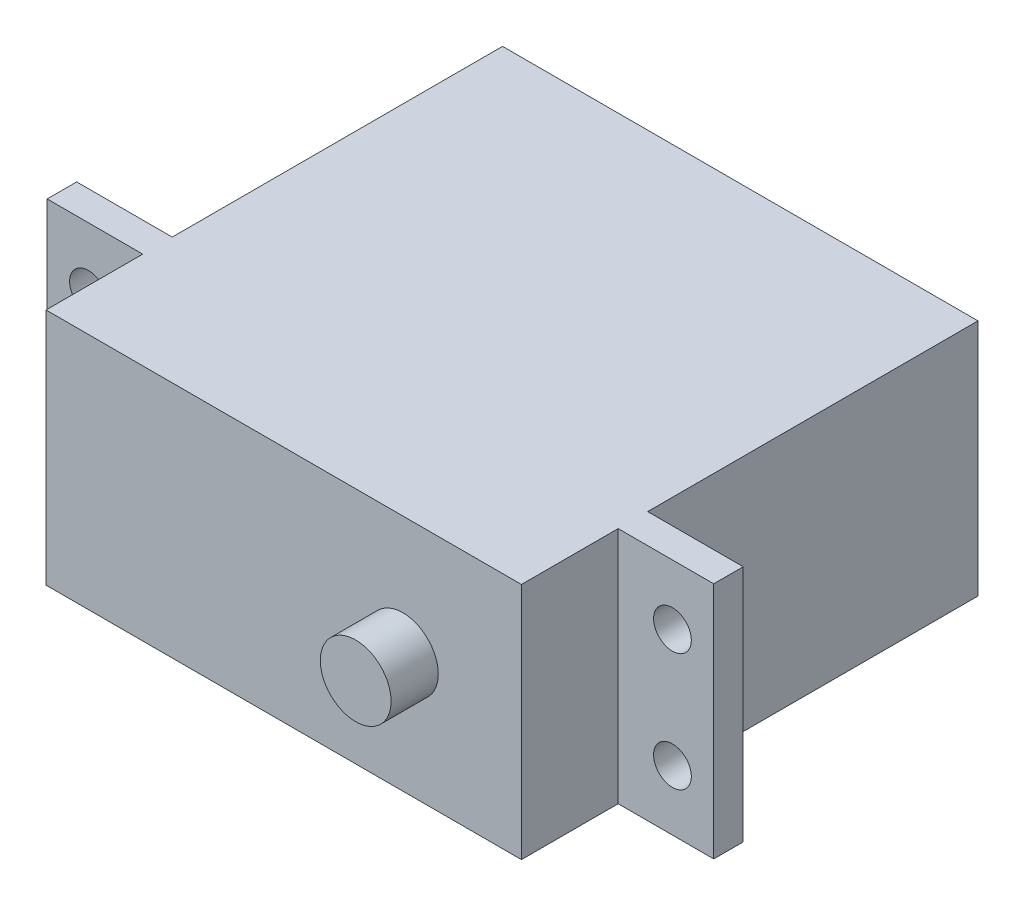
ISO-10303-21;
HEADER;
FILE_DESCRIPTION(('STEP AP214'),'2;1');
FILE_NAME('part.step','',(''),(''),'','','');
FILE_SCHEMA(('AUTOMOTIVE_DESIGN { 1 0 10303 214 1 1 1 1 }'));
ENDSEC;
DATA;
#1=APPLICATION_CONTEXT('core data for automotive mechanical design processes');
#2=APPLICATION_PROTOCOL_DEFINITION('international standard','automotive_design',2000,#1);
#3=PRODUCT_CONTEXT('',#1,'mechanical');
#4=PRODUCT('Part','Part','',(#3));
#5=PRODUCT_RELATED_PRODUCT_CATEGORY('part','',(#4));
#6=PRODUCT_DEFINITION_FORMATION('','',#4);
#7=PRODUCT_DEFINITION_CONTEXT('part definition',#1,'design');
#8=PRODUCT_DEFINITION('design','',#6,#7);
#9=PRODUCT_DEFINITION_SHAPE('','',#8);
#10=(LENGTH_UNIT() NAMED_UNIT(*) SI_UNIT(.MILLI.,.METRE.));
#11=(NAMED_UNIT(*) PLANE_ANGLE_UNIT() SI_UNIT($,.RADIAN.));
#12=(NAMED_UNIT(*) SI_UNIT($,.STERADIAN.) SOLID_ANGLE_UNIT());
#13=UNCERTAINTY_MEASURE_WITH_UNIT(LENGTH_MEASURE(1.E-05),#10,'distance_accuracy_value','');
#14=(GEOMETRIC_REPRESENTATION_CONTEXT(3) GLOBAL_UNCERTAINTY_ASSIGNED_CONTEXT((#13)) GLOBAL_UNIT_ASSIGNED_CONTEXT((#10,
#11,#12)) REPRESENTATION_CONTEXT('',''));
#15=CARTESIAN_POINT('',(0.,0.,0.));
#16=DIRECTION('',(0.,0.,1.));
#17=DIRECTION('',(1.,0.,0.));
#18=AXIS2_PLACEMENT_3D('',#15,#16,#17);
#19=CARTESIAN_POINT('',(-121.25,93.5,12.7));
#20=DIRECTION('',(1.,0.,0.));
#21=DIRECTION('',(0.,0.,-1.));
#22=AXIS2_PLACEMENT_3D('',#19,#20,#21);
#23=PLANE('',#22);
#24=DIRECTION('',(0.,-1.,0.));
#25=VECTOR('',#24,1.);
#26=CARTESIAN_POINT('',(-121.25,93.5,2.));
#27=LINE('',#26,#25);
#28=CARTESIAN_POINT('',(-121.25,93.5,2.));
#29=VERTEX_POINT('',#28);
#30=CARTESIAN_POINT('',(-121.25,73.3,2.));
#31=VERTEX_POINT('',#30);
#32=EDGE_CURVE('E60',#29,#31,#27,.T.);
#33=ORIENTED_EDGE('',*,*,#32,.F.);
#34=DIRECTION('',(0.,0.,-1.));
#35=VECTOR('',#34,1.);
#36=CARTESIAN_POINT('',(-121.25,93.5,12.7));
#37=LINE('',#36,#35);
#38=CARTESIAN_POINT('',(-121.25,93.5,-26.));
#39=VERTEX_POINT('',#38);
#40=EDGE_CURVE('E179',#29,#39,#37,.T.);
#41=ORIENTED_EDGE('',*,*,#40,.T.);
#42=DIRECTION('',(0.,-1.,0.));
#43=VECTOR('',#42,1.);
#44=CARTESIAN_POINT('',(-121.25,93.5,-26.));
#45=LINE('',#44,#43);
#46=CARTESIAN_POINT('',(-121.25,73.3,-26.));
#47=VERTEX_POINT('',#46);
#48=EDGE_CURVE('E169',#39,#47,#45,.T.);
#49=ORIENTED_EDGE('',*,*,#48,.T.);
#50=DIRECTION('',(0.,0.,-1.));
#51=VECTOR('',#50,1.);
#52=CARTESIAN_POINT('',(-121.25,73.3,12.7));
#53=LINE('',#52,#51);
#54=EDGE_CURVE('E198',#31,#47,#53,.T.);
#55=ORIENTED_EDGE('',*,*,#54,.F.);
#56=EDGE_LOOP('',(#33,#41,#49,#55));
#57=FACE_BOUND('',#56,.T.);
#58=ADVANCED_FACE('F41',(#57),#23,.F.);
#59=CARTESIAN_POINT('',(-80.95,73.3,12.7));
#60=DIRECTION('',(-1.,0.,0.));
#61=DIRECTION('',(0.,0.,1.));
#62=AXIS2_PLACEMENT_3D('',#59,#60,#61);
#63=PLANE('',#62);
#64=DIRECTION('',(0.,1.,0.));
#65=VECTOR('',#64,1.);
#66=CARTESIAN_POINT('',(-80.95,73.3,2.));
#67=LINE('',#66,#65);
#68=CARTESIAN_POINT('',(-80.95,73.3,2.));
#69=VERTEX_POINT('',#68);
#70=CARTESIAN_POINT('',(-80.95,93.5,2.));
#71=VERTEX_POINT('',#70);
#72=EDGE_CURVE('E200',#69,#71,#67,.T.);
#73=ORIENTED_EDGE('',*,*,#72,.F.);
#74=DIRECTION('',(0.,0.,-1.));
#75=VECTOR('',#74,1.);
#76=CARTESIAN_POINT('',(-80.95,73.3,12.7));
#77=LINE('',#76,#75);
#78=CARTESIAN_POINT('',(-80.95,73.3,-26.));
#79=VERTEX_POINT('',#78);
#80=EDGE_CURVE('E196',#69,#79,#77,.T.);
#81=ORIENTED_EDGE('',*,*,#80,.T.);
#82=DIRECTION('',(0.,1.,0.));
#83=VECTOR('',#82,1.);
#84=CARTESIAN_POINT('',(-80.95,73.3,-26.));
#85=LINE('',#84,#83);
#86=CARTESIAN_POINT('',(-80.95,93.5,-26.));
#87=VERTEX_POINT('',#86);
#88=EDGE_CURVE('E187',#79,#87,#85,.T.);
#89=ORIENTED_EDGE('',*,*,#88,.T.);
#90=DIRECTION('',(0.,0.,-1.));
#91=VECTOR('',#90,1.);
#92=CARTESIAN_POINT('',(-80.95,93.5,12.7));
#93=LINE('',#92,#91);
#94=EDGE_CURVE('E195',#71,#87,#93,.T.);
#95=ORIENTED_EDGE('',*,*,#94,.F.);
#96=EDGE_LOOP('',(#73,#81,#89,#95));
#97=FACE_BOUND('',#96,.T.);
#98=ADVANCED_FACE('F246',(#97),#63,.F.);
#99=CARTESIAN_POINT('',(-121.25,93.5,12.7));
#100=VERTEX_POINT('',#99);
#101=CARTESIAN_POINT('',(-121.25,93.5,4.5));
#102=VERTEX_POINT('',#101);
#103=EDGE_CURVE('E63',#100,#102,#37,.T.);
#104=ORIENTED_EDGE('',*,*,#103,.T.);
#105=DIRECTION('',(0.,-1.,0.));
#106=VECTOR('',#105,1.);
#107=CARTESIAN_POINT('',(-121.25,93.5,4.5));
#108=LINE('',#107,#106);
#109=CARTESIAN_POINT('',(-121.25,73.3,4.5));
#110=VERTEX_POINT('',#109);
#111=EDGE_CURVE('E163',#102,#110,#108,.T.);
#112=ORIENTED_EDGE('',*,*,#111,.T.);
#113=CARTESIAN_POINT('',(-121.25,73.3,12.7));
#114=VERTEX_POINT('',#113);
#115=EDGE_CURVE('E142',#114,#110,#53,.T.);
#116=ORIENTED_EDGE('',*,*,#115,.F.);
#117=DIRECTION('',(0.,-1.,0.));
#118=VECTOR('',#117,1.);
#119=CARTESIAN_POINT('',(-121.25,93.5,12.7));
#120=LINE('',#119,#118);
#121=EDGE_CURVE('E167',#100,#114,#120,.T.);
#122=ORIENTED_EDGE('',*,*,#121,.F.);
#123=EDGE_LOOP('',(#104,#112,#116,#122));
#124=FACE_BOUND('',#123,.T.);
#125=ADVANCED_FACE('F43',(#124),#23,.F.);
#126=CARTESIAN_POINT('',(-121.25,73.3,12.7));
#127=DIRECTION('',(0.,1.,0.));
#128=DIRECTION('',(0.,0.,1.));
#129=AXIS2_PLACEMENT_3D('',#126,#127,#128);
#130=PLANE('',#129);
#131=ORIENTED_EDGE('',*,*,#115,.T.);
#132=DIRECTION('',(1.,0.,0.));
#133=VECTOR('',#132,1.);
#134=CARTESIAN_POINT('',(-129.35,73.3,4.5));
#135=LINE('',#134,#133);
#136=CARTESIAN_POINT('',(-129.35,73.3,4.5));
#137=VERTEX_POINT('',#136);
#138=EDGE_CURVE('E134',#137,#110,#135,.T.);
#139=ORIENTED_EDGE('',*,*,#138,.F.);
#140=DIRECTION('',(0.,0.,-1.));
#141=VECTOR('',#140,1.);
#142=CARTESIAN_POINT('',(-129.35,73.3,4.5));
#143=LINE('',#142,#141);
#144=CARTESIAN_POINT('',(-129.35,73.3,2.));
#145=VERTEX_POINT('',#144);
#146=EDGE_CURVE('E136',#137,#145,#143,.T.);
#147=ORIENTED_EDGE('',*,*,#146,.T.);
#148=DIRECTION('',(1.,0.,0.));
#149=VECTOR('',#148,1.);
#150=CARTESIAN_POINT('',(-129.35,73.3,2.));
#151=LINE('',#150,#149);
#152=EDGE_CURVE('E235',#145,#31,#151,.T.);
#153=ORIENTED_EDGE('',*,*,#152,.T.);
#154=ORIENTED_EDGE('',*,*,#54,.T.);
#155=DIRECTION('',(1.,0.,0.));
#156=VECTOR('',#155,1.);
#157=CARTESIAN_POINT('',(-121.25,73.3,-26.));
#158=LINE('',#157,#156);
#159=EDGE_CURVE('E182',#47,#79,#158,.T.);
#160=ORIENTED_EDGE('',*,*,#159,.T.);
#161=ORIENTED_EDGE('',*,*,#80,.F.);
#162=CARTESIAN_POINT('',(-72.85,73.3,2.));
#163=VERTEX_POINT('',#162);
#164=EDGE_CURVE('E229',#69,#163,#151,.T.);
#165=ORIENTED_EDGE('',*,*,#164,.T.);
#166=DIRECTION('',(0.,0.,-1.));
#167=VECTOR('',#166,1.);
#168=CARTESIAN_POINT('',(-72.85,73.3,4.5));
#169=LINE('',#168,#167);
#170=CARTESIAN_POINT('',(-72.85,73.3,4.5));
#171=VERTEX_POINT('',#170);
#172=EDGE_CURVE('E157',#171,#163,#169,.T.);
#173=ORIENTED_EDGE('',*,*,#172,.F.);
#174=CARTESIAN_POINT('',(-80.95,73.3,4.5));
#175=VERTEX_POINT('',#174);
#176=EDGE_CURVE('E144',#175,#171,#135,.T.);
#177=ORIENTED_EDGE('',*,*,#176,.F.);
#178=CARTESIAN_POINT('',(-80.95,73.3,12.7));
#179=VERTEX_POINT('',#178);
#180=EDGE_CURVE('E197',#179,#175,#77,.T.);
#181=ORIENTED_EDGE('',*,*,#180,.F.);
#182=DIRECTION('',(1.,0.,0.));
#183=VECTOR('',#182,1.);
#184=CARTESIAN_POINT('',(-121.25,73.3,12.7));
#185=LINE('',#184,#183);
#186=EDGE_CURVE('E173',#114,#179,#185,.T.);
#187=ORIENTED_EDGE('',*,*,#186,.F.);
#188=EDGE_LOOP('',(#131,#139,#147,#153,#154,#160,#161,#165,#173,#177,#181,#187));
#189=FACE_BOUND('',#188,.T.);
#190=ADVANCED_FACE('F135',(#189),#130,.F.);
#191=ORIENTED_EDGE('',*,*,#180,.T.);
#192=DIRECTION('',(0.,1.,0.));
#193=VECTOR('',#192,1.);
#194=CARTESIAN_POINT('',(-80.95,73.3,4.5));
#195=LINE('',#194,#193);
#196=CARTESIAN_POINT('',(-80.95,93.5,4.5));
#197=VERTEX_POINT('',#196);
#198=EDGE_CURVE('E44',#175,#197,#195,.T.);
#199=ORIENTED_EDGE('',*,*,#198,.T.);
#200=CARTESIAN_POINT('',(-80.95,93.5,12.7));
#201=VERTEX_POINT('',#200);
#202=EDGE_CURVE('E194',#201,#197,#93,.T.);
#203=ORIENTED_EDGE('',*,*,#202,.F.);
#204=DIRECTION('',(0.,1.,0.));
#205=VECTOR('',#204,1.);
#206=CARTESIAN_POINT('',(-80.95,73.3,12.7));
#207=LINE('',#206,#205);
#208=EDGE_CURVE('E176',#179,#201,#207,.T.);
#209=ORIENTED_EDGE('',*,*,#208,.F.);
#210=EDGE_LOOP('',(#191,#199,#203,#209));
#211=FACE_BOUND('',#210,.T.);
#212=ADVANCED_FACE('F209',(#211),#63,.F.);
#213=CARTESIAN_POINT('',(-80.95,93.5,12.7));
#214=DIRECTION('',(0.,-1.,0.));
#215=DIRECTION('',(0.,0.,-1.));
#216=AXIS2_PLACEMENT_3D('',#213,#214,#215);
#217=PLANE('',#216);
#218=ORIENTED_EDGE('',*,*,#202,.T.);
#219=DIRECTION('',(-1.,0.,0.));
#220=VECTOR('',#219,1.);
#221=CARTESIAN_POINT('',(-72.85,93.5,4.5));
#222=LINE('',#221,#220);
#223=CARTESIAN_POINT('',(-72.85,93.5,4.5));
#224=VERTEX_POINT('',#223);
#225=EDGE_CURVE('E220',#224,#197,#222,.T.);
#226=ORIENTED_EDGE('',*,*,#225,.F.);
#227=DIRECTION('',(0.,0.,-1.));
#228=VECTOR('',#227,1.);
#229=CARTESIAN_POINT('',(-72.85,93.5,4.5));
#230=LINE('',#229,#228);
#231=CARTESIAN_POINT('',(-72.85,93.5,2.));
#232=VERTEX_POINT('',#231);
#233=EDGE_CURVE('E165',#224,#232,#230,.T.);
#234=ORIENTED_EDGE('',*,*,#233,.T.);
#235=DIRECTION('',(-1.,0.,0.));
#236=VECTOR('',#235,1.);
#237=CARTESIAN_POINT('',(-72.85,93.5,2.));
#238=LINE('',#237,#236);
#239=EDGE_CURVE('E153',#232,#71,#238,.T.);
#240=ORIENTED_EDGE('',*,*,#239,.T.);
#241=ORIENTED_EDGE('',*,*,#94,.T.);
#242=DIRECTION('',(-1.,0.,0.));
#243=VECTOR('',#242,1.);
#244=CARTESIAN_POINT('',(-80.95,93.5,-26.));
#245=LINE('',#244,#243);
#246=EDGE_CURVE('E172',#87,#39,#245,.T.);
#247=ORIENTED_EDGE('',*,*,#246,.T.);
#248=ORIENTED_EDGE('',*,*,#40,.F.);
#249=CARTESIAN_POINT('',(-129.35,93.5,2.));
#250=VERTEX_POINT('',#249);
#251=EDGE_CURVE('E236',#29,#250,#238,.T.);
#252=ORIENTED_EDGE('',*,*,#251,.T.);
#253=DIRECTION('',(0.,0.,-1.));
#254=VECTOR('',#253,1.);
#255=CARTESIAN_POINT('',(-129.35,93.5,4.5));
#256=LINE('',#255,#254);
#257=CARTESIAN_POINT('',(-129.35,93.5,4.5));
#258=VERTEX_POINT('',#257);
#259=EDGE_CURVE('E222',#258,#250,#256,.T.);
#260=ORIENTED_EDGE('',*,*,#259,.F.);
#261=EDGE_CURVE('E148',#102,#258,#222,.T.);
#262=ORIENTED_EDGE('',*,*,#261,.F.);
#263=ORIENTED_EDGE('',*,*,#103,.F.);
#264=DIRECTION('',(-1.,0.,0.));
#265=VECTOR('',#264,1.);
#266=CARTESIAN_POINT('',(-80.95,93.5,12.7));
#267=LINE('',#266,#265);
#268=EDGE_CURVE('E178',#201,#100,#267,.T.);
#269=ORIENTED_EDGE('',*,*,#268,.F.);
#270=EDGE_LOOP('',(#218,#226,#234,#240,#241,#247,#248,#252,#260,#262,#263,#269));
#271=FACE_BOUND('',#270,.T.);
#272=ADVANCED_FACE('F219',(#271),#217,.F.);
#273=CARTESIAN_POINT('',(0.,0.,12.7));
#274=DIRECTION('',(0.,0.,1.));
#275=DIRECTION('',(1.,0.,0.));
#276=AXIS2_PLACEMENT_3D('',#273,#274,#275);
#277=PLANE('',#276);
#278=CARTESIAN_POINT('',(-91.,83.4,12.7));
#279=DIRECTION('',(0.,0.,1.));
#280=DIRECTION('',(1.,0.,0.));
#281=AXIS2_PLACEMENT_3D('',#278,#279,#280);
#282=CIRCLE('',#281,3.);
#283=CARTESIAN_POINT('',(-88.,83.4,12.7));
#284=VERTEX_POINT('',#283);
#285=EDGE_CURVE('E11',#284,#284,#282,.T.);
#286=ORIENTED_EDGE('',*,*,#285,.F.);
#287=EDGE_LOOP('',(#286));
#288=FACE_BOUND('',#287,.T.);
#289=ORIENTED_EDGE('',*,*,#121,.T.);
#290=ORIENTED_EDGE('',*,*,#186,.T.);
#291=ORIENTED_EDGE('',*,*,#208,.T.);
#292=ORIENTED_EDGE('',*,*,#268,.T.);
#293=EDGE_LOOP('',(#289,#290,#291,#292));
#294=FACE_BOUND('',#293,.T.);
#295=ADVANCED_FACE('F253',(#288,#294),#277,.T.);
#296=CARTESIAN_POINT('',(0.,0.,-26.));
#297=DIRECTION('',(0.,0.,1.));
#298=DIRECTION('',(1.,0.,0.));
#299=AXIS2_PLACEMENT_3D('',#296,#297,#298);
#300=PLANE('',#299);
#301=ORIENTED_EDGE('',*,*,#48,.F.);
#302=ORIENTED_EDGE('',*,*,#246,.F.);
#303=ORIENTED_EDGE('',*,*,#88,.F.);
#304=ORIENTED_EDGE('',*,*,#159,.F.);
#305=EDGE_LOOP('',(#301,#302,#303,#304));
#306=FACE_BOUND('',#305,.T.);
#307=ADVANCED_FACE('F252',(#306),#300,.F.);
#308=CARTESIAN_POINT('',(-72.85,73.3,4.5));
#309=DIRECTION('',(-1.,0.,0.));
#310=DIRECTION('',(0.,0.,1.));
#311=AXIS2_PLACEMENT_3D('',#308,#309,#310);
#312=PLANE('',#311);
#313=DIRECTION('',(0.,1.,0.));
#314=VECTOR('',#313,1.);
#315=CARTESIAN_POINT('',(-72.85,73.3,2.));
#316=LINE('',#315,#314);
#317=EDGE_CURVE('E234',#163,#232,#316,.T.);
#318=ORIENTED_EDGE('',*,*,#317,.T.);
#319=ORIENTED_EDGE('',*,*,#233,.F.);
#320=DIRECTION('',(0.,1.,0.));
#321=VECTOR('',#320,1.);
#322=CARTESIAN_POINT('',(-72.85,73.3,4.5));
#323=LINE('',#322,#321);
#324=EDGE_CURVE('E141',#171,#224,#323,.T.);
#325=ORIENTED_EDGE('',*,*,#324,.F.);
#326=ORIENTED_EDGE('',*,*,#172,.T.);
#327=EDGE_LOOP('',(#318,#319,#325,#326));
#328=FACE_BOUND('',#327,.T.);
#329=ADVANCED_FACE('F239',(#328),#312,.F.);
#330=CARTESIAN_POINT('',(0.,0.,2.));
#331=DIRECTION('',(0.,0.,1.));
#332=DIRECTION('',(1.,0.,0.));
#333=AXIS2_PLACEMENT_3D('',#330,#331,#332);
#334=PLANE('',#333);
#335=CARTESIAN_POINT('',(-76.35,78.4,2.));
#336=DIRECTION('',(0.,0.,1.));
#337=DIRECTION('',(1.,0.,0.));
#338=AXIS2_PLACEMENT_3D('',#335,#336,#337);
#339=CIRCLE('',#338,1.6);
#340=CARTESIAN_POINT('',(-74.75,78.4,2.));
#341=VERTEX_POINT('',#340);
#342=EDGE_CURVE('E386',#341,#341,#339,.T.);
#343=ORIENTED_EDGE('',*,*,#342,.T.);
#344=EDGE_LOOP('',(#343));
#345=FACE_BOUND('',#344,.T.);
#346=CARTESIAN_POINT('',(-76.35,88.4,2.));
#347=DIRECTION('',(0.,0.,1.));
#348=DIRECTION('',(1.,0.,0.));
#349=AXIS2_PLACEMENT_3D('',#346,#347,#348);
#350=CIRCLE('',#349,1.6);
#351=CARTESIAN_POINT('',(-74.75,88.4,2.));
#352=VERTEX_POINT('',#351);
#353=EDGE_CURVE('E392',#352,#352,#350,.T.);
#354=ORIENTED_EDGE('',*,*,#353,.T.);
#355=EDGE_LOOP('',(#354));
#356=FACE_BOUND('',#355,.T.);
#357=ORIENTED_EDGE('',*,*,#164,.F.);
#358=ORIENTED_EDGE('',*,*,#72,.T.);
#359=ORIENTED_EDGE('',*,*,#239,.F.);
#360=ORIENTED_EDGE('',*,*,#317,.F.);
#361=EDGE_LOOP('',(#357,#358,#359,#360));
#362=FACE_BOUND('',#361,.T.);
#363=ADVANCED_FACE('F237',(#345,#356,#362),#334,.F.);
#364=CARTESIAN_POINT('',(0.,0.,4.5));
#365=DIRECTION('',(0.,0.,1.));
#366=DIRECTION('',(1.,0.,0.));
#367=AXIS2_PLACEMENT_3D('',#364,#365,#366);
#368=PLANE('',#367);
#369=CARTESIAN_POINT('',(-76.35,78.4,4.5));
#370=DIRECTION('',(0.,0.,1.));
#371=DIRECTION('',(1.,0.,0.));
#372=AXIS2_PLACEMENT_3D('',#369,#370,#371);
#373=CIRCLE('',#372,1.6);
#374=CARTESIAN_POINT('',(-74.75,78.4,4.5));
#375=VERTEX_POINT('',#374);
#376=EDGE_CURVE('E393',#375,#375,#373,.T.);
#377=ORIENTED_EDGE('',*,*,#376,.F.);
#378=EDGE_LOOP('',(#377));
#379=FACE_BOUND('',#378,.T.);
#380=CARTESIAN_POINT('',(-76.35,88.4,4.5));
#381=DIRECTION('',(0.,0.,1.));
#382=DIRECTION('',(1.,0.,0.));
#383=AXIS2_PLACEMENT_3D('',#380,#381,#382);
#384=CIRCLE('',#383,1.6);
#385=CARTESIAN_POINT('',(-74.75,88.4,4.5));
#386=VERTEX_POINT('',#385);
#387=EDGE_CURVE('E395',#386,#386,#384,.T.);
#388=ORIENTED_EDGE('',*,*,#387,.F.);
#389=EDGE_LOOP('',(#388));
#390=FACE_BOUND('',#389,.T.);
#391=ORIENTED_EDGE('',*,*,#198,.F.);
#392=ORIENTED_EDGE('',*,*,#176,.T.);
#393=ORIENTED_EDGE('',*,*,#324,.T.);
#394=ORIENTED_EDGE('',*,*,#225,.T.);
#395=EDGE_LOOP('',(#391,#392,#393,#394));
#396=FACE_BOUND('',#395,.T.);
#397=ADVANCED_FACE('F223',(#379,#390,#396),#368,.T.);
#398=CARTESIAN_POINT('',(-125.85,88.4,4.5));
#399=DIRECTION('',(0.,0.,1.));
#400=DIRECTION('',(1.,0.,0.));
#401=AXIS2_PLACEMENT_3D('',#398,#399,#400);
#402=CIRCLE('',#401,1.6);
#403=CARTESIAN_POINT('',(-124.25,88.4,4.5));
#404=VERTEX_POINT('',#403);
#405=EDGE_CURVE('E404',#404,#404,#402,.T.);
#406=ORIENTED_EDGE('',*,*,#405,.F.);
#407=EDGE_LOOP('',(#406));
#408=FACE_BOUND('',#407,.T.);
#409=CARTESIAN_POINT('',(-125.85,78.4,4.5));
#410=DIRECTION('',(0.,0.,1.));
#411=DIRECTION('',(1.,0.,0.));
#412=AXIS2_PLACEMENT_3D('',#409,#410,#411);
#413=CIRCLE('',#412,1.6);
#414=CARTESIAN_POINT('',(-124.25,78.4,4.5));
#415=VERTEX_POINT('',#414);
#416=EDGE_CURVE('E409',#415,#415,#413,.T.);
#417=ORIENTED_EDGE('',*,*,#416,.F.);
#418=EDGE_LOOP('',(#417));
#419=FACE_BOUND('',#418,.T.);
#420=ORIENTED_EDGE('',*,*,#111,.F.);
#421=ORIENTED_EDGE('',*,*,#261,.T.);
#422=DIRECTION('',(0.,-1.,0.));
#423=VECTOR('',#422,1.);
#424=CARTESIAN_POINT('',(-129.35,93.5,4.5));
#425=LINE('',#424,#423);
#426=EDGE_CURVE('E150',#258,#137,#425,.T.);
#427=ORIENTED_EDGE('',*,*,#426,.T.);
#428=ORIENTED_EDGE('',*,*,#138,.T.);
#429=EDGE_LOOP('',(#420,#421,#427,#428));
#430=FACE_BOUND('',#429,.T.);
#431=ADVANCED_FACE('F149',(#408,#419,#430),#368,.T.);
#432=CARTESIAN_POINT('',(-125.85,88.4,2.));
#433=DIRECTION('',(0.,0.,1.));
#434=DIRECTION('',(1.,0.,0.));
#435=AXIS2_PLACEMENT_3D('',#432,#433,#434);
#436=CIRCLE('',#435,1.6);
#437=CARTESIAN_POINT('',(-124.25,88.4,2.));
#438=VERTEX_POINT('',#437);
#439=EDGE_CURVE('E402',#438,#438,#436,.T.);
#440=ORIENTED_EDGE('',*,*,#439,.T.);
#441=EDGE_LOOP('',(#440));
#442=FACE_BOUND('',#441,.T.);
#443=CARTESIAN_POINT('',(-125.85,78.4,2.));
#444=DIRECTION('',(0.,0.,1.));
#445=DIRECTION('',(1.,0.,0.));
#446=AXIS2_PLACEMENT_3D('',#443,#444,#445);
#447=CIRCLE('',#446,1.6);
#448=CARTESIAN_POINT('',(-124.25,78.4,2.));
#449=VERTEX_POINT('',#448);
#450=EDGE_CURVE('E401',#449,#449,#447,.T.);
#451=ORIENTED_EDGE('',*,*,#450,.T.);
#452=EDGE_LOOP('',(#451));
#453=FACE_BOUND('',#452,.T.);
#454=ORIENTED_EDGE('',*,*,#251,.F.);
#455=ORIENTED_EDGE('',*,*,#32,.T.);
#456=ORIENTED_EDGE('',*,*,#152,.F.);
#457=DIRECTION('',(0.,-1.,0.));
#458=VECTOR('',#457,1.);
#459=CARTESIAN_POINT('',(-129.35,93.5,2.));
#460=LINE('',#459,#458);
#461=EDGE_CURVE('E156',#250,#145,#460,.T.);
#462=ORIENTED_EDGE('',*,*,#461,.F.);
#463=EDGE_LOOP('',(#454,#455,#456,#462));
#464=FACE_BOUND('',#463,.T.);
#465=ADVANCED_FACE('F254',(#442,#453,#464),#334,.F.);
#466=CARTESIAN_POINT('',(-129.35,93.5,4.5));
#467=DIRECTION('',(1.,0.,0.));
#468=DIRECTION('',(0.,0.,-1.));
#469=AXIS2_PLACEMENT_3D('',#466,#467,#468);
#470=PLANE('',#469);
#471=ORIENTED_EDGE('',*,*,#461,.T.);
#472=ORIENTED_EDGE('',*,*,#146,.F.);
#473=ORIENTED_EDGE('',*,*,#426,.F.);
#474=ORIENTED_EDGE('',*,*,#259,.T.);
#475=EDGE_LOOP('',(#471,#472,#473,#474));
#476=FACE_BOUND('',#475,.T.);
#477=ADVANCED_FACE('F158',(#476),#470,.F.);
#478=CARTESIAN_POINT('',(-91.,83.4,16.7));
#479=DIRECTION('',(0.,0.,-1.));
#480=DIRECTION('',(-1.,0.,0.));
#481=AXIS2_PLACEMENT_3D('',#478,#479,#480);
#482=CYLINDRICAL_SURFACE('',#481,3.);
#483=CARTESIAN_POINT('',(-91.,83.4,16.7));
#484=DIRECTION('',(0.,0.,1.));
#485=DIRECTION('',(1.,0.,0.));
#486=AXIS2_PLACEMENT_3D('',#483,#484,#485);
#487=CIRCLE('',#486,3.);
#488=CARTESIAN_POINT('',(-88.,83.4,16.7));
#489=VERTEX_POINT('',#488);
#490=EDGE_CURVE('E233',#489,#489,#487,.T.);
#491=ORIENTED_EDGE('',*,*,#490,.F.);
#492=EDGE_LOOP('',(#491));
#493=FACE_BOUND('',#492,.T.);
#494=ORIENTED_EDGE('',*,*,#285,.T.);
#495=EDGE_LOOP('',(#494));
#496=FACE_BOUND('',#495,.T.);
#497=ADVANCED_FACE('F305',(#493,#496),#482,.T.);
#498=CARTESIAN_POINT('',(-91.,83.4,16.7));
#499=DIRECTION('',(0.,0.,1.));
#500=DIRECTION('',(1.,0.,0.));
#501=AXIS2_PLACEMENT_3D('',#498,#499,#500);
#502=PLANE('',#501);
#503=ORIENTED_EDGE('',*,*,#490,.T.);
#504=EDGE_LOOP('',(#503));
#505=FACE_BOUND('',#504,.T.);
#506=ADVANCED_FACE('F319',(#505),#502,.T.);
#507=CARTESIAN_POINT('',(-125.85,78.4,4.5));
#508=DIRECTION('',(0.,0.,-1.));
#509=DIRECTION('',(-1.,0.,0.));
#510=AXIS2_PLACEMENT_3D('',#507,#508,#509);
#511=CYLINDRICAL_SURFACE('',#510,1.6);
#512=ORIENTED_EDGE('',*,*,#416,.T.);
#513=EDGE_LOOP('',(#512));
#514=FACE_BOUND('',#513,.T.);
#515=ORIENTED_EDGE('',*,*,#450,.F.);
#516=EDGE_LOOP('',(#515));
#517=FACE_BOUND('',#516,.T.);
#518=ADVANCED_FACE('F329',(#514,#517),#511,.F.);
#519=CARTESIAN_POINT('',(-125.85,88.4,4.5));
#520=DIRECTION('',(0.,0.,-1.));
#521=DIRECTION('',(-1.,0.,0.));
#522=AXIS2_PLACEMENT_3D('',#519,#520,#521);
#523=CYLINDRICAL_SURFACE('',#522,1.6);
#524=ORIENTED_EDGE('',*,*,#405,.T.);
#525=EDGE_LOOP('',(#524));
#526=FACE_BOUND('',#525,.T.);
#527=ORIENTED_EDGE('',*,*,#439,.F.);
#528=EDGE_LOOP('',(#527));
#529=FACE_BOUND('',#528,.T.);
#530=ADVANCED_FACE('F339',(#526,#529),#523,.F.);
#531=CARTESIAN_POINT('',(-76.35,88.4,4.5));
#532=DIRECTION('',(0.,0.,-1.));
#533=DIRECTION('',(-1.,0.,0.));
#534=AXIS2_PLACEMENT_3D('',#531,#532,#533);
#535=CYLINDRICAL_SURFACE('',#534,1.6);
#536=ORIENTED_EDGE('',*,*,#387,.T.);
#537=EDGE_LOOP('',(#536));
#538=FACE_BOUND('',#537,.T.);
#539=ORIENTED_EDGE('',*,*,#353,.F.);
#540=EDGE_LOOP('',(#539));
#541=FACE_BOUND('',#540,.T.);
#542=ADVANCED_FACE('F348',(#538,#541),#535,.F.);
#543=CARTESIAN_POINT('',(-76.35,78.4,4.5));
#544=DIRECTION('',(0.,0.,-1.));
#545=DIRECTION('',(-1.,0.,0.));
#546=AXIS2_PLACEMENT_3D('',#543,#544,#545);
#547=CYLINDRICAL_SURFACE('',#546,1.6);
#548=ORIENTED_EDGE('',*,*,#376,.T.);
#549=EDGE_LOOP('',(#548));
#550=FACE_BOUND('',#549,.T.);
#551=ORIENTED_EDGE('',*,*,#342,.F.);
#552=EDGE_LOOP('',(#551));
#553=FACE_BOUND('',#552,.T.);
#554=ADVANCED_FACE('F360',(#550,#553),#547,.F.);
#555=CLOSED_SHELL('',(#58,#98,#125,#190,#212,#272,#295,#307,#329,#363,#397,#431,#465,#477,#497,
#506,#518,#530,#542,#554));
#556=MANIFOLD_SOLID_BREP('B2',#555);
#557=ADVANCED_BREP_SHAPE_REPRESENTATION('',(#18,#556),#14);
#558=SHAPE_DEFINITION_REPRESENTATION(#9,#557);
ENDSEC;
END-ISO-10303-21;
